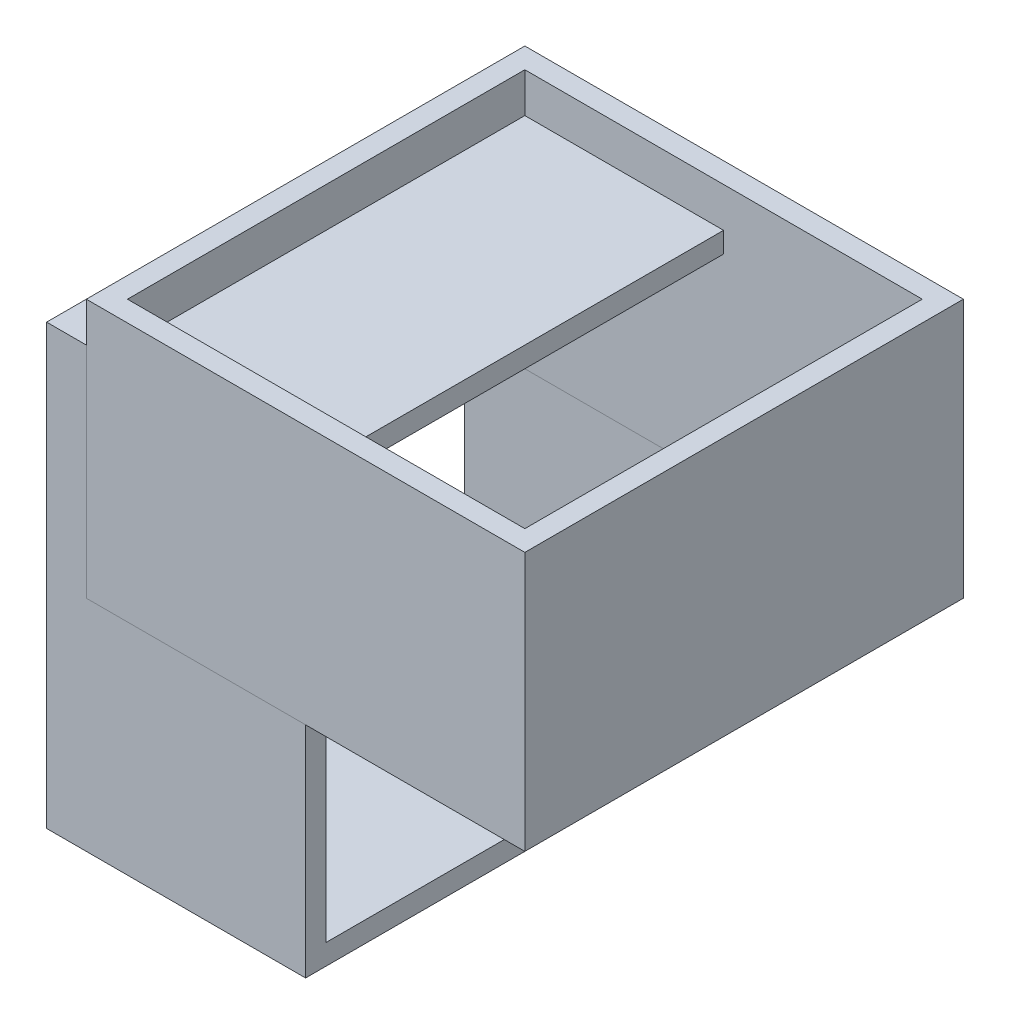
ISO-10303-21;
HEADER;
FILE_DESCRIPTION(('STEP AP214'),'2;1');
FILE_NAME('part.step','',(''),(''),'','','');
FILE_SCHEMA(('AUTOMOTIVE_DESIGN { 1 0 10303 214 1 1 1 1 }'));
ENDSEC;
DATA;
#1=APPLICATION_CONTEXT('core data for automotive mechanical design processes');
#2=APPLICATION_PROTOCOL_DEFINITION('international standard','automotive_design',2000,#1);
#3=PRODUCT_CONTEXT('',#1,'mechanical');
#4=PRODUCT('Part','Part','',(#3));
#5=PRODUCT_RELATED_PRODUCT_CATEGORY('part','',(#4));
#6=PRODUCT_DEFINITION_FORMATION('','',#4);
#7=PRODUCT_DEFINITION_CONTEXT('part definition',#1,'design');
#8=PRODUCT_DEFINITION('design','',#6,#7);
#9=PRODUCT_DEFINITION_SHAPE('','',#8);
#10=(LENGTH_UNIT() NAMED_UNIT(*) SI_UNIT(.MILLI.,.METRE.));
#11=(NAMED_UNIT(*) PLANE_ANGLE_UNIT() SI_UNIT($,.RADIAN.));
#12=(NAMED_UNIT(*) SI_UNIT($,.STERADIAN.) SOLID_ANGLE_UNIT());
#13=UNCERTAINTY_MEASURE_WITH_UNIT(LENGTH_MEASURE(1.E-05),#10,'distance_accuracy_value','');
#14=(GEOMETRIC_REPRESENTATION_CONTEXT(3) GLOBAL_UNCERTAINTY_ASSIGNED_CONTEXT((#13)) GLOBAL_UNIT_ASSIGNED_CONTEXT((#10,
#11,#12)) REPRESENTATION_CONTEXT('',''));
#15=CARTESIAN_POINT('',(0.,0.,0.));
#16=DIRECTION('',(0.,0.,1.));
#17=DIRECTION('',(1.,0.,0.));
#18=AXIS2_PLACEMENT_3D('',#15,#16,#17);
#19=CARTESIAN_POINT('',(9.2,60.,50.8));
#20=DIRECTION('',(1.,0.,0.));
#21=DIRECTION('',(0.,0.,-1.));
#22=AXIS2_PLACEMENT_3D('',#19,#20,#21);
#23=PLANE('',#22);
#24=DIRECTION('',(0.,0.,1.));
#25=VECTOR('',#24,1.);
#26=CARTESIAN_POINT('',(9.2,0.,50.8));
#27=LINE('',#26,#25);
#28=CARTESIAN_POINT('',(9.19999999999999,0.,-50.8));
#29=VERTEX_POINT('',#28);
#30=CARTESIAN_POINT('',(9.2,0.,50.8));
#31=VERTEX_POINT('',#30);
#32=EDGE_CURVE('E163',#29,#31,#27,.T.);
#33=ORIENTED_EDGE('',*,*,#32,.T.);
#34=DIRECTION('',(0.,-1.,0.));
#35=VECTOR('',#34,1.);
#36=CARTESIAN_POINT('',(9.2,60.,50.8));
#37=LINE('',#36,#35);
#38=CARTESIAN_POINT('',(9.2,60.,50.8));
#39=VERTEX_POINT('',#38);
#40=EDGE_CURVE('E12',#39,#31,#37,.T.);
#41=ORIENTED_EDGE('',*,*,#40,.F.);
#42=DIRECTION('',(0.,0.,1.));
#43=VECTOR('',#42,1.);
#44=CARTESIAN_POINT('',(9.2,60.,50.8));
#45=LINE('',#44,#43);
#46=CARTESIAN_POINT('',(9.19999999999999,60.,-50.8));
#47=VERTEX_POINT('',#46);
#48=EDGE_CURVE('E137',#47,#39,#45,.T.);
#49=ORIENTED_EDGE('',*,*,#48,.F.);
#50=DIRECTION('',(0.,-1.,0.));
#51=VECTOR('',#50,1.);
#52=CARTESIAN_POINT('',(9.19999999999999,60.,-50.8));
#53=LINE('',#52,#51);
#54=EDGE_CURVE('E173',#47,#29,#53,.T.);
#55=ORIENTED_EDGE('',*,*,#54,.T.);
#56=EDGE_LOOP('',(#33,#41,#49,#55));
#57=FACE_BOUND('',#56,.T.);
#58=ADVANCED_FACE('F60',(#57),#23,.F.);
#59=CARTESIAN_POINT('',(9.2,60.,50.8));
#60=DIRECTION('',(0.,0.,-1.));
#61=DIRECTION('',(-1.,0.,0.));
#62=AXIS2_PLACEMENT_3D('',#59,#60,#61);
#63=PLANE('',#62);
#64=DIRECTION('',(1.,0.,0.));
#65=VECTOR('',#64,1.);
#66=CARTESIAN_POINT('',(9.2,0.,50.8));
#67=LINE('',#66,#65);
#68=CARTESIAN_POINT('',(110.8,0.,50.8));
#69=VERTEX_POINT('',#68);
#70=EDGE_CURVE('E141',#31,#69,#67,.T.);
#71=ORIENTED_EDGE('',*,*,#70,.T.);
#72=DIRECTION('',(0.,-1.,0.));
#73=VECTOR('',#72,1.);
#74=CARTESIAN_POINT('',(110.8,60.,50.8));
#75=LINE('',#74,#73);
#76=CARTESIAN_POINT('',(110.8,60.,50.8));
#77=VERTEX_POINT('',#76);
#78=EDGE_CURVE('E70',#77,#69,#75,.T.);
#79=ORIENTED_EDGE('',*,*,#78,.F.);
#80=DIRECTION('',(1.,0.,0.));
#81=VECTOR('',#80,1.);
#82=CARTESIAN_POINT('',(9.2,60.,50.8));
#83=LINE('',#82,#81);
#84=EDGE_CURVE('E134',#39,#77,#83,.T.);
#85=ORIENTED_EDGE('',*,*,#84,.F.);
#86=ORIENTED_EDGE('',*,*,#40,.T.);
#87=EDGE_LOOP('',(#71,#79,#85,#86));
#88=FACE_BOUND('',#87,.T.);
#89=ADVANCED_FACE('F142',(#88),#63,.F.);
#90=CARTESIAN_POINT('',(110.8,60.,-50.8));
#91=DIRECTION('',(-1.,0.,0.));
#92=DIRECTION('',(0.,0.,1.));
#93=AXIS2_PLACEMENT_3D('',#90,#91,#92);
#94=PLANE('',#93);
#95=DIRECTION('',(0.,0.,-1.));
#96=VECTOR('',#95,1.);
#97=CARTESIAN_POINT('',(110.8,0.,-50.8));
#98=LINE('',#97,#96);
#99=CARTESIAN_POINT('',(110.8,0.,-50.8));
#100=VERTEX_POINT('',#99);
#101=EDGE_CURVE('E104',#69,#100,#98,.T.);
#102=ORIENTED_EDGE('',*,*,#101,.T.);
#103=DIRECTION('',(0.,-1.,0.));
#104=VECTOR('',#103,1.);
#105=CARTESIAN_POINT('',(110.8,60.,-50.8));
#106=LINE('',#105,#104);
#107=CARTESIAN_POINT('',(110.8,60.,-50.8));
#108=VERTEX_POINT('',#107);
#109=EDGE_CURVE('E145',#108,#100,#106,.T.);
#110=ORIENTED_EDGE('',*,*,#109,.F.);
#111=DIRECTION('',(0.,0.,-1.));
#112=VECTOR('',#111,1.);
#113=CARTESIAN_POINT('',(110.8,60.,-50.8));
#114=LINE('',#113,#112);
#115=EDGE_CURVE('E136',#77,#108,#114,.T.);
#116=ORIENTED_EDGE('',*,*,#115,.F.);
#117=ORIENTED_EDGE('',*,*,#78,.T.);
#118=EDGE_LOOP('',(#102,#110,#116,#117));
#119=FACE_BOUND('',#118,.T.);
#120=ADVANCED_FACE('F148',(#119),#94,.F.);
#121=CARTESIAN_POINT('',(13.9625,60.,46.0375));
#122=DIRECTION('',(0.,0.,-1.));
#123=DIRECTION('',(-1.,0.,0.));
#124=AXIS2_PLACEMENT_3D('',#121,#122,#123);
#125=PLANE('',#124);
#126=DIRECTION('',(1.,0.,0.));
#127=VECTOR('',#126,1.);
#128=CARTESIAN_POINT('',(13.9625,0.,46.0375));
#129=LINE('',#128,#127);
#130=CARTESIAN_POINT('',(13.9625,0.,46.0375));
#131=VERTEX_POINT('',#130);
#132=CARTESIAN_POINT('',(106.0375,0.,46.0375));
#133=VERTEX_POINT('',#132);
#134=EDGE_CURVE('E155',#131,#133,#129,.T.);
#135=ORIENTED_EDGE('',*,*,#134,.F.);
#136=DIRECTION('',(0.,-1.,0.));
#137=VECTOR('',#136,1.);
#138=CARTESIAN_POINT('',(13.9625,60.,46.0375));
#139=LINE('',#138,#137);
#140=CARTESIAN_POINT('',(13.9625,60.,46.0375));
#141=VERTEX_POINT('',#140);
#142=EDGE_CURVE('E63',#141,#131,#139,.T.);
#143=ORIENTED_EDGE('',*,*,#142,.F.);
#144=DIRECTION('',(1.,0.,0.));
#145=VECTOR('',#144,1.);
#146=CARTESIAN_POINT('',(13.9625,60.,46.0375));
#147=LINE('',#146,#145);
#148=CARTESIAN_POINT('',(106.0375,60.,46.0375));
#149=VERTEX_POINT('',#148);
#150=EDGE_CURVE('E168',#141,#149,#147,.T.);
#151=ORIENTED_EDGE('',*,*,#150,.T.);
#152=DIRECTION('',(0.,-1.,0.));
#153=VECTOR('',#152,1.);
#154=CARTESIAN_POINT('',(106.0375,60.,46.0375));
#155=LINE('',#154,#153);
#156=EDGE_CURVE('E146',#149,#133,#155,.T.);
#157=ORIENTED_EDGE('',*,*,#156,.T.);
#158=EDGE_LOOP('',(#135,#143,#151,#157));
#159=FACE_BOUND('',#158,.T.);
#160=ADVANCED_FACE('F56',(#159),#125,.T.);
#161=CARTESIAN_POINT('',(13.9625,60.,46.0375));
#162=DIRECTION('',(1.,0.,0.));
#163=DIRECTION('',(0.,0.,-1.));
#164=AXIS2_PLACEMENT_3D('',#161,#162,#163);
#165=PLANE('',#164);
#166=DIRECTION('',(0.,0.,1.));
#167=VECTOR('',#166,1.);
#168=CARTESIAN_POINT('',(13.9625,0.,46.0375));
#169=LINE('',#168,#167);
#170=CARTESIAN_POINT('',(13.9625,0.,-46.0375));
#171=VERTEX_POINT('',#170);
#172=EDGE_CURVE('E154',#171,#131,#169,.T.);
#173=ORIENTED_EDGE('',*,*,#172,.F.);
#174=DIRECTION('',(0.,-1.,0.));
#175=VECTOR('',#174,1.);
#176=CARTESIAN_POINT('',(13.9625,60.,-46.0375));
#177=LINE('',#176,#175);
#178=CARTESIAN_POINT('',(13.9625,60.,-46.0375));
#179=VERTEX_POINT('',#178);
#180=EDGE_CURVE('E176',#179,#171,#177,.T.);
#181=ORIENTED_EDGE('',*,*,#180,.F.);
#182=DIRECTION('',(0.,0.,1.));
#183=VECTOR('',#182,1.);
#184=CARTESIAN_POINT('',(13.9625,60.,46.0375));
#185=LINE('',#184,#183);
#186=EDGE_CURVE('E183',#179,#141,#185,.T.);
#187=ORIENTED_EDGE('',*,*,#186,.T.);
#188=ORIENTED_EDGE('',*,*,#142,.T.);
#189=EDGE_LOOP('',(#173,#181,#187,#188));
#190=FACE_BOUND('',#189,.T.);
#191=ADVANCED_FACE('F181',(#190),#165,.T.);
#192=CARTESIAN_POINT('',(106.0375,60.,-46.0375));
#193=DIRECTION('',(0.,0.,1.));
#194=DIRECTION('',(1.,0.,0.));
#195=AXIS2_PLACEMENT_3D('',#192,#193,#194);
#196=PLANE('',#195);
#197=DIRECTION('',(-1.,0.,0.));
#198=VECTOR('',#197,1.);
#199=CARTESIAN_POINT('',(106.0375,0.,-46.0375));
#200=LINE('',#199,#198);
#201=CARTESIAN_POINT('',(106.0375,0.,-46.0375));
#202=VERTEX_POINT('',#201);
#203=EDGE_CURVE('E158',#202,#171,#200,.T.);
#204=ORIENTED_EDGE('',*,*,#203,.F.);
#205=DIRECTION('',(0.,-1.,0.));
#206=VECTOR('',#205,1.);
#207=CARTESIAN_POINT('',(106.0375,60.,-46.0375));
#208=LINE('',#207,#206);
#209=CARTESIAN_POINT('',(106.0375,60.,-46.0375));
#210=VERTEX_POINT('',#209);
#211=EDGE_CURVE('E171',#210,#202,#208,.T.);
#212=ORIENTED_EDGE('',*,*,#211,.F.);
#213=DIRECTION('',(-1.,0.,0.));
#214=VECTOR('',#213,1.);
#215=CARTESIAN_POINT('',(106.0375,60.,-46.0375));
#216=LINE('',#215,#214);
#217=EDGE_CURVE('E195',#210,#179,#216,.T.);
#218=ORIENTED_EDGE('',*,*,#217,.T.);
#219=ORIENTED_EDGE('',*,*,#180,.T.);
#220=EDGE_LOOP('',(#204,#212,#218,#219));
#221=FACE_BOUND('',#220,.T.);
#222=ADVANCED_FACE('F186',(#221),#196,.T.);
#223=CARTESIAN_POINT('',(106.0375,60.,-46.0375));
#224=DIRECTION('',(-1.,0.,0.));
#225=DIRECTION('',(0.,0.,1.));
#226=AXIS2_PLACEMENT_3D('',#223,#224,#225);
#227=PLANE('',#226);
#228=DIRECTION('',(0.,0.,-1.));
#229=VECTOR('',#228,1.);
#230=CARTESIAN_POINT('',(106.0375,0.,-46.0375));
#231=LINE('',#230,#229);
#232=EDGE_CURVE('E161',#133,#202,#231,.T.);
#233=ORIENTED_EDGE('',*,*,#232,.F.);
#234=ORIENTED_EDGE('',*,*,#156,.F.);
#235=DIRECTION('',(0.,0.,-1.));
#236=VECTOR('',#235,1.);
#237=CARTESIAN_POINT('',(106.0375,60.,-46.0375));
#238=LINE('',#237,#236);
#239=EDGE_CURVE('E197',#149,#210,#238,.T.);
#240=ORIENTED_EDGE('',*,*,#239,.T.);
#241=ORIENTED_EDGE('',*,*,#211,.T.);
#242=EDGE_LOOP('',(#233,#234,#240,#241));
#243=FACE_BOUND('',#242,.T.);
#244=ADVANCED_FACE('F200',(#243),#227,.T.);
#245=CARTESIAN_POINT('',(110.8,60.,-50.8));
#246=DIRECTION('',(0.,0.,1.));
#247=DIRECTION('',(1.,0.,0.));
#248=AXIS2_PLACEMENT_3D('',#245,#246,#247);
#249=PLANE('',#248);
#250=DIRECTION('',(-1.,0.,0.));
#251=VECTOR('',#250,1.);
#252=CARTESIAN_POINT('',(110.8,0.,-50.8));
#253=LINE('',#252,#251);
#254=EDGE_CURVE('E112',#100,#29,#253,.T.);
#255=ORIENTED_EDGE('',*,*,#254,.T.);
#256=ORIENTED_EDGE('',*,*,#54,.F.);
#257=DIRECTION('',(-1.,0.,0.));
#258=VECTOR('',#257,1.);
#259=CARTESIAN_POINT('',(110.8,60.,-50.8));
#260=LINE('',#259,#258);
#261=EDGE_CURVE('E78',#108,#47,#260,.T.);
#262=ORIENTED_EDGE('',*,*,#261,.F.);
#263=ORIENTED_EDGE('',*,*,#109,.T.);
#264=EDGE_LOOP('',(#255,#256,#262,#263));
#265=FACE_BOUND('',#264,.T.);
#266=ADVANCED_FACE('F204',(#265),#249,.F.);
#267=CARTESIAN_POINT('',(60.,60.,0.));
#268=DIRECTION('',(0.,1.,0.));
#269=DIRECTION('',(0.,0.,-1.));
#270=AXIS2_PLACEMENT_3D('',#267,#268,#269);
#271=PLANE('',#270);
#272=ORIENTED_EDGE('',*,*,#150,.F.);
#273=ORIENTED_EDGE('',*,*,#186,.F.);
#274=ORIENTED_EDGE('',*,*,#217,.F.);
#275=ORIENTED_EDGE('',*,*,#239,.F.);
#276=EDGE_LOOP('',(#272,#273,#274,#275));
#277=FACE_BOUND('',#276,.T.);
#278=ORIENTED_EDGE('',*,*,#48,.T.);
#279=ORIENTED_EDGE('',*,*,#84,.T.);
#280=ORIENTED_EDGE('',*,*,#115,.T.);
#281=ORIENTED_EDGE('',*,*,#261,.T.);
#282=EDGE_LOOP('',(#278,#279,#280,#281));
#283=FACE_BOUND('',#282,.T.);
#284=ADVANCED_FACE('F135',(#277,#283),#271,.T.);
#285=CARTESIAN_POINT('',(60.,0.,0.));
#286=DIRECTION('',(0.,1.,0.));
#287=DIRECTION('',(0.,0.,-1.));
#288=AXIS2_PLACEMENT_3D('',#285,#286,#287);
#289=PLANE('',#288);
#290=ORIENTED_EDGE('',*,*,#134,.T.);
#291=ORIENTED_EDGE('',*,*,#232,.T.);
#292=ORIENTED_EDGE('',*,*,#203,.T.);
#293=ORIENTED_EDGE('',*,*,#172,.T.);
#294=EDGE_LOOP('',(#290,#291,#292,#293));
#295=FACE_BOUND('',#294,.T.);
#296=ORIENTED_EDGE('',*,*,#32,.F.);
#297=ORIENTED_EDGE('',*,*,#254,.F.);
#298=ORIENTED_EDGE('',*,*,#101,.F.);
#299=ORIENTED_EDGE('',*,*,#70,.F.);
#300=EDGE_LOOP('',(#296,#297,#298,#299));
#301=FACE_BOUND('',#300,.T.);
#302=ADVANCED_FACE('F187',(#295,#301),#289,.F.);
#303=CLOSED_SHELL('',(#58,#89,#120,#160,#191,#222,#244,#266,#284,#302));
#304=MANIFOLD_SOLID_BREP('B2',#303);
#305=CARTESIAN_POINT('',(60.,50.8,50.8));
#306=DIRECTION('',(0.,-1.,0.));
#307=DIRECTION('',(0.,0.,-1.));
#308=AXIS2_PLACEMENT_3D('',#305,#306,#307);
#309=PLANE('',#308);
#310=DIRECTION('',(0.,0.,1.));
#311=VECTOR('',#310,1.);
#312=CARTESIAN_POINT('',(0.,50.8,50.8));
#313=LINE('',#312,#311);
#314=CARTESIAN_POINT('',(0.,50.8,-50.8));
#315=VERTEX_POINT('',#314);
#316=CARTESIAN_POINT('',(0.,50.8,50.8));
#317=VERTEX_POINT('',#316);
#318=EDGE_CURVE('E413',#315,#317,#313,.T.);
#319=ORIENTED_EDGE('',*,*,#318,.T.);
#320=DIRECTION('',(-1.,0.,0.));
#321=VECTOR('',#320,1.);
#322=CARTESIAN_POINT('',(60.,50.8,50.8));
#323=LINE('',#322,#321);
#324=CARTESIAN_POINT('',(60.,50.8,50.8));
#325=VERTEX_POINT('',#324);
#326=EDGE_CURVE('E54',#325,#317,#323,.T.);
#327=ORIENTED_EDGE('',*,*,#326,.F.);
#328=DIRECTION('',(0.,0.,1.));
#329=VECTOR('',#328,1.);
#330=CARTESIAN_POINT('',(60.,50.8,50.8));
#331=LINE('',#330,#329);
#332=CARTESIAN_POINT('',(60.,50.8,-50.8));
#333=VERTEX_POINT('',#332);
#334=EDGE_CURVE('E389',#333,#325,#331,.T.);
#335=ORIENTED_EDGE('',*,*,#334,.F.);
#336=DIRECTION('',(-1.,0.,0.));
#337=VECTOR('',#336,1.);
#338=CARTESIAN_POINT('',(60.,50.8,-50.8));
#339=LINE('',#338,#337);
#340=EDGE_CURVE('E423',#333,#315,#339,.T.);
#341=ORIENTED_EDGE('',*,*,#340,.T.);
#342=EDGE_LOOP('',(#319,#327,#335,#341));
#343=FACE_BOUND('',#342,.T.);
#344=ADVANCED_FACE('F307',(#343),#309,.F.);
#345=CARTESIAN_POINT('',(60.,50.8,50.8));
#346=DIRECTION('',(0.,0.,-1.));
#347=DIRECTION('',(-1.,0.,0.));
#348=AXIS2_PLACEMENT_3D('',#345,#346,#347);
#349=PLANE('',#348);
#350=DIRECTION('',(0.,-1.,0.));
#351=VECTOR('',#350,1.);
#352=CARTESIAN_POINT('',(0.,50.8,50.8));
#353=LINE('',#352,#351);
#354=CARTESIAN_POINT('',(0.,-50.8,50.8));
#355=VERTEX_POINT('',#354);
#356=EDGE_CURVE('E392',#317,#355,#353,.T.);
#357=ORIENTED_EDGE('',*,*,#356,.T.);
#358=DIRECTION('',(-1.,0.,0.));
#359=VECTOR('',#358,1.);
#360=CARTESIAN_POINT('',(60.,-50.8,50.8));
#361=LINE('',#360,#359);
#362=CARTESIAN_POINT('',(60.,-50.8,50.8));
#363=VERTEX_POINT('',#362);
#364=EDGE_CURVE('E320',#363,#355,#361,.T.);
#365=ORIENTED_EDGE('',*,*,#364,.F.);
#366=DIRECTION('',(0.,-1.,0.));
#367=VECTOR('',#366,1.);
#368=CARTESIAN_POINT('',(60.,50.8,50.8));
#369=LINE('',#368,#367);
#370=EDGE_CURVE('E385',#325,#363,#369,.T.);
#371=ORIENTED_EDGE('',*,*,#370,.F.);
#372=ORIENTED_EDGE('',*,*,#326,.T.);
#373=EDGE_LOOP('',(#357,#365,#371,#372));
#374=FACE_BOUND('',#373,.T.);
#375=ADVANCED_FACE('F394',(#374),#349,.F.);
#376=CARTESIAN_POINT('',(60.,-50.8,-50.8));
#377=DIRECTION('',(0.,1.,0.));
#378=DIRECTION('',(0.,0.,1.));
#379=AXIS2_PLACEMENT_3D('',#376,#377,#378);
#380=PLANE('',#379);
#381=DIRECTION('',(0.,0.,-1.));
#382=VECTOR('',#381,1.);
#383=CARTESIAN_POINT('',(0.,-50.8,-50.8));
#384=LINE('',#383,#382);
#385=CARTESIAN_POINT('',(0.,-50.8,-50.8));
#386=VERTEX_POINT('',#385);
#387=EDGE_CURVE('E351',#355,#386,#384,.T.);
#388=ORIENTED_EDGE('',*,*,#387,.T.);
#389=DIRECTION('',(-1.,0.,0.));
#390=VECTOR('',#389,1.);
#391=CARTESIAN_POINT('',(60.,-50.8,-50.8));
#392=LINE('',#391,#390);
#393=CARTESIAN_POINT('',(60.,-50.8,-50.8));
#394=VERTEX_POINT('',#393);
#395=EDGE_CURVE('E395',#394,#386,#392,.T.);
#396=ORIENTED_EDGE('',*,*,#395,.F.);
#397=DIRECTION('',(0.,0.,-1.));
#398=VECTOR('',#397,1.);
#399=CARTESIAN_POINT('',(60.,-50.8,-50.8));
#400=LINE('',#399,#398);
#401=EDGE_CURVE('E387',#363,#394,#400,.T.);
#402=ORIENTED_EDGE('',*,*,#401,.F.);
#403=ORIENTED_EDGE('',*,*,#364,.T.);
#404=EDGE_LOOP('',(#388,#396,#402,#403));
#405=FACE_BOUND('',#404,.T.);
#406=ADVANCED_FACE('F396',(#405),#380,.F.);
#407=CARTESIAN_POINT('',(60.,46.0375,46.0375));
#408=DIRECTION('',(0.,0.,-1.));
#409=DIRECTION('',(-1.,0.,0.));
#410=AXIS2_PLACEMENT_3D('',#407,#408,#409);
#411=PLANE('',#410);
#412=DIRECTION('',(0.,-1.,0.));
#413=VECTOR('',#412,1.);
#414=CARTESIAN_POINT('',(0.,46.0375,46.0375));
#415=LINE('',#414,#413);
#416=CARTESIAN_POINT('',(0.,46.0375,46.0375));
#417=VERTEX_POINT('',#416);
#418=CARTESIAN_POINT('',(0.,-46.0375,46.0375));
#419=VERTEX_POINT('',#418);
#420=EDGE_CURVE('E405',#417,#419,#415,.T.);
#421=ORIENTED_EDGE('',*,*,#420,.F.);
#422=DIRECTION('',(-1.,0.,0.));
#423=VECTOR('',#422,1.);
#424=CARTESIAN_POINT('',(60.,46.0375,46.0375));
#425=LINE('',#424,#423);
#426=CARTESIAN_POINT('',(60.,46.0375,46.0375));
#427=VERTEX_POINT('',#426);
#428=EDGE_CURVE('E313',#427,#417,#425,.T.);
#429=ORIENTED_EDGE('',*,*,#428,.F.);
#430=DIRECTION('',(0.,-1.,0.));
#431=VECTOR('',#430,1.);
#432=CARTESIAN_POINT('',(60.,46.0375,46.0375));
#433=LINE('',#432,#431);
#434=CARTESIAN_POINT('',(60.,-46.0375,46.0375));
#435=VERTEX_POINT('',#434);
#436=EDGE_CURVE('E419',#427,#435,#433,.T.);
#437=ORIENTED_EDGE('',*,*,#436,.T.);
#438=DIRECTION('',(-1.,0.,0.));
#439=VECTOR('',#438,1.);
#440=CARTESIAN_POINT('',(60.,-46.0375,46.0375));
#441=LINE('',#440,#439);
#442=EDGE_CURVE('E397',#435,#419,#441,.T.);
#443=ORIENTED_EDGE('',*,*,#442,.T.);
#444=EDGE_LOOP('',(#421,#429,#437,#443));
#445=FACE_BOUND('',#444,.T.);
#446=ADVANCED_FACE('F310',(#445),#411,.T.);
#447=CARTESIAN_POINT('',(60.,46.0375,46.0375));
#448=DIRECTION('',(0.,-1.,0.));
#449=DIRECTION('',(0.,0.,-1.));
#450=AXIS2_PLACEMENT_3D('',#447,#448,#449);
#451=PLANE('',#450);
#452=DIRECTION('',(0.,0.,1.));
#453=VECTOR('',#452,1.);
#454=CARTESIAN_POINT('',(0.,46.0375,46.0375));
#455=LINE('',#454,#453);
#456=CARTESIAN_POINT('',(0.,46.0375,-46.0375));
#457=VERTEX_POINT('',#456);
#458=EDGE_CURVE('E403',#457,#417,#455,.T.);
#459=ORIENTED_EDGE('',*,*,#458,.F.);
#460=DIRECTION('',(-1.,0.,0.));
#461=VECTOR('',#460,1.);
#462=CARTESIAN_POINT('',(60.,46.0375,-46.0375));
#463=LINE('',#462,#461);
#464=CARTESIAN_POINT('',(60.,46.0375,-46.0375));
#465=VERTEX_POINT('',#464);
#466=EDGE_CURVE('E426',#465,#457,#463,.T.);
#467=ORIENTED_EDGE('',*,*,#466,.F.);
#468=DIRECTION('',(0.,0.,1.));
#469=VECTOR('',#468,1.);
#470=CARTESIAN_POINT('',(60.,46.0375,46.0375));
#471=LINE('',#470,#469);
#472=EDGE_CURVE('E434',#465,#427,#471,.T.);
#473=ORIENTED_EDGE('',*,*,#472,.T.);
#474=ORIENTED_EDGE('',*,*,#428,.T.);
#475=EDGE_LOOP('',(#459,#467,#473,#474));
#476=FACE_BOUND('',#475,.T.);
#477=ADVANCED_FACE('F433',(#476),#451,.T.);
#478=CARTESIAN_POINT('',(60.,-46.0375,-46.0375));
#479=DIRECTION('',(0.,0.,1.));
#480=DIRECTION('',(1.,0.,0.));
#481=AXIS2_PLACEMENT_3D('',#478,#479,#480);
#482=PLANE('',#481);
#483=DIRECTION('',(0.,1.,0.));
#484=VECTOR('',#483,1.);
#485=CARTESIAN_POINT('',(0.,-46.0375,-46.0375));
#486=LINE('',#485,#484);
#487=CARTESIAN_POINT('',(0.,-46.0375,-46.0375));
#488=VERTEX_POINT('',#487);
#489=EDGE_CURVE('E407',#488,#457,#486,.T.);
#490=ORIENTED_EDGE('',*,*,#489,.F.);
#491=DIRECTION('',(-1.,0.,0.));
#492=VECTOR('',#491,1.);
#493=CARTESIAN_POINT('',(60.,-46.0375,-46.0375));
#494=LINE('',#493,#492);
#495=CARTESIAN_POINT('',(60.,-46.0375,-46.0375));
#496=VERTEX_POINT('',#495);
#497=EDGE_CURVE('E422',#496,#488,#494,.T.);
#498=ORIENTED_EDGE('',*,*,#497,.F.);
#499=DIRECTION('',(0.,1.,0.));
#500=VECTOR('',#499,1.);
#501=CARTESIAN_POINT('',(60.,-46.0375,-46.0375));
#502=LINE('',#501,#500);
#503=EDGE_CURVE('E445',#496,#465,#502,.T.);
#504=ORIENTED_EDGE('',*,*,#503,.T.);
#505=ORIENTED_EDGE('',*,*,#466,.T.);
#506=EDGE_LOOP('',(#490,#498,#504,#505));
#507=FACE_BOUND('',#506,.T.);
#508=ADVANCED_FACE('F439',(#507),#482,.T.);
#509=CARTESIAN_POINT('',(60.,-46.0375,-46.0375));
#510=DIRECTION('',(0.,1.,0.));
#511=DIRECTION('',(0.,0.,1.));
#512=AXIS2_PLACEMENT_3D('',#509,#510,#511);
#513=PLANE('',#512);
#514=DIRECTION('',(0.,0.,-1.));
#515=VECTOR('',#514,1.);
#516=CARTESIAN_POINT('',(0.,-46.0375,-46.0375));
#517=LINE('',#516,#515);
#518=EDGE_CURVE('E411',#419,#488,#517,.T.);
#519=ORIENTED_EDGE('',*,*,#518,.F.);
#520=ORIENTED_EDGE('',*,*,#442,.F.);
#521=DIRECTION('',(0.,0.,-1.));
#522=VECTOR('',#521,1.);
#523=CARTESIAN_POINT('',(60.,-46.0375,-46.0375));
#524=LINE('',#523,#522);
#525=EDGE_CURVE('E449',#435,#496,#524,.T.);
#526=ORIENTED_EDGE('',*,*,#525,.T.);
#527=ORIENTED_EDGE('',*,*,#497,.T.);
#528=EDGE_LOOP('',(#519,#520,#526,#527));
#529=FACE_BOUND('',#528,.T.);
#530=ADVANCED_FACE('F450',(#529),#513,.T.);
#531=CARTESIAN_POINT('',(60.,-50.8,-50.8));
#532=DIRECTION('',(0.,0.,1.));
#533=DIRECTION('',(0.,-1.,0.));
#534=AXIS2_PLACEMENT_3D('',#531,#532,#533);
#535=PLANE('',#534);
#536=DIRECTION('',(0.,1.,0.));
#537=VECTOR('',#536,1.);
#538=CARTESIAN_POINT('',(0.,-50.8,-50.8));
#539=LINE('',#538,#537);
#540=EDGE_CURVE('E363',#386,#315,#539,.T.);
#541=ORIENTED_EDGE('',*,*,#540,.T.);
#542=ORIENTED_EDGE('',*,*,#340,.F.);
#543=DIRECTION('',(0.,1.,0.));
#544=VECTOR('',#543,1.);
#545=CARTESIAN_POINT('',(60.,-50.8,-50.8));
#546=LINE('',#545,#544);
#547=EDGE_CURVE('E326',#394,#333,#546,.T.);
#548=ORIENTED_EDGE('',*,*,#547,.F.);
#549=ORIENTED_EDGE('',*,*,#395,.T.);
#550=EDGE_LOOP('',(#541,#542,#548,#549));
#551=FACE_BOUND('',#550,.T.);
#552=ADVANCED_FACE('F453',(#551),#535,.F.);
#553=CARTESIAN_POINT('',(60.,0.,0.));
#554=DIRECTION('',(1.,0.,0.));
#555=DIRECTION('',(0.,0.,-1.));
#556=AXIS2_PLACEMENT_3D('',#553,#554,#555);
#557=PLANE('',#556);
#558=ORIENTED_EDGE('',*,*,#436,.F.);
#559=ORIENTED_EDGE('',*,*,#472,.F.);
#560=ORIENTED_EDGE('',*,*,#503,.F.);
#561=ORIENTED_EDGE('',*,*,#525,.F.);
#562=EDGE_LOOP('',(#558,#559,#560,#561));
#563=FACE_BOUND('',#562,.T.);
#564=ORIENTED_EDGE('',*,*,#334,.T.);
#565=ORIENTED_EDGE('',*,*,#370,.T.);
#566=ORIENTED_EDGE('',*,*,#401,.T.);
#567=ORIENTED_EDGE('',*,*,#547,.T.);
#568=EDGE_LOOP('',(#564,#565,#566,#567));
#569=FACE_BOUND('',#568,.T.);
#570=ADVANCED_FACE('F383',(#563,#569),#557,.T.);
#571=CARTESIAN_POINT('',(0.,0.,0.));
#572=DIRECTION('',(1.,0.,0.));
#573=DIRECTION('',(0.,0.,-1.));
#574=AXIS2_PLACEMENT_3D('',#571,#572,#573);
#575=PLANE('',#574);
#576=ORIENTED_EDGE('',*,*,#420,.T.);
#577=ORIENTED_EDGE('',*,*,#518,.T.);
#578=ORIENTED_EDGE('',*,*,#489,.T.);
#579=ORIENTED_EDGE('',*,*,#458,.T.);
#580=EDGE_LOOP('',(#576,#577,#578,#579));
#581=FACE_BOUND('',#580,.T.);
#582=ORIENTED_EDGE('',*,*,#318,.F.);
#583=ORIENTED_EDGE('',*,*,#540,.F.);
#584=ORIENTED_EDGE('',*,*,#387,.F.);
#585=ORIENTED_EDGE('',*,*,#356,.F.);
#586=EDGE_LOOP('',(#582,#583,#584,#585));
#587=FACE_BOUND('',#586,.T.);
#588=ADVANCED_FACE('F437',(#581,#587),#575,.F.);
#589=CLOSED_SHELL('',(#344,#375,#406,#446,#477,#508,#530,#552,#570,#588));
#590=MANIFOLD_SOLID_BREP('B6',#589);
#591=ADVANCED_BREP_SHAPE_REPRESENTATION('',(#18,#304,#590),#14);
#592=SHAPE_DEFINITION_REPRESENTATION(#9,#591);
ENDSEC;
END-ISO-10303-21;
